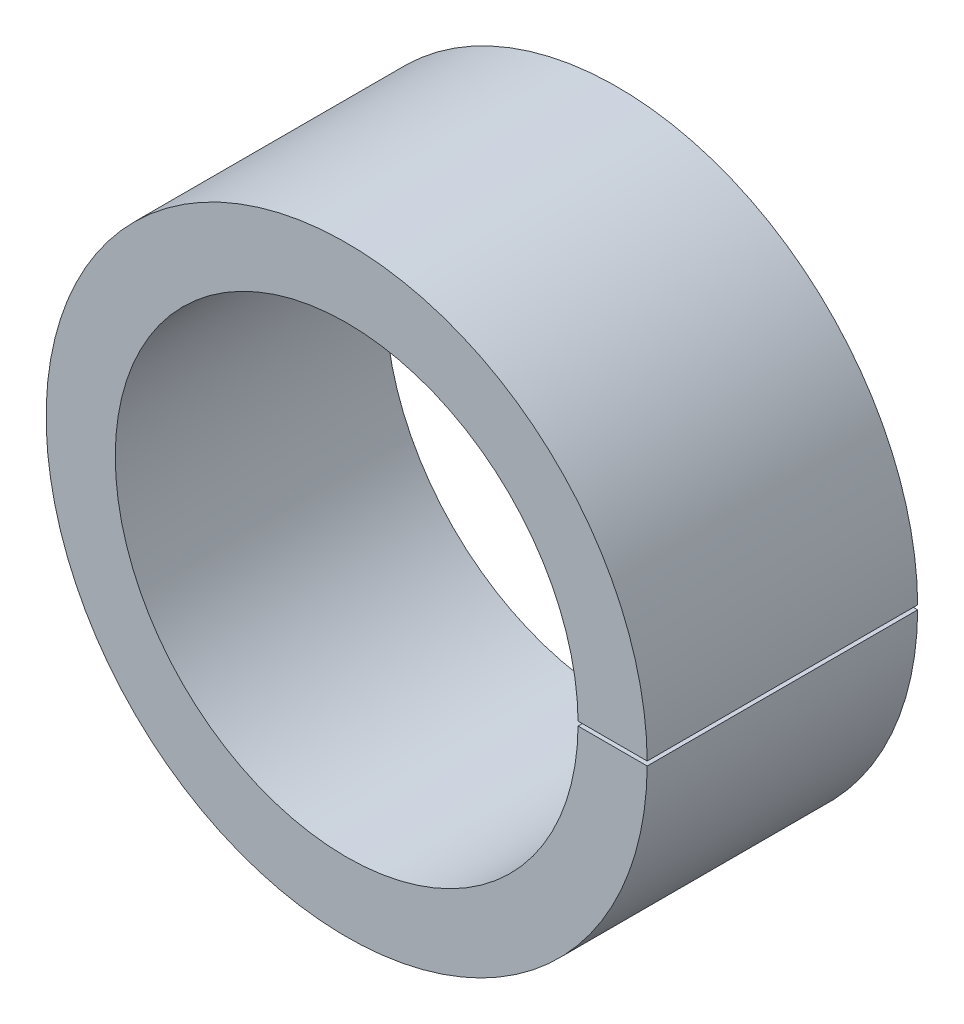
ISO-10303-21;
HEADER;
FILE_DESCRIPTION(('STEP AP214'),'2;1');
FILE_NAME('part.step','',(''),(''),'','','');
FILE_SCHEMA(('AUTOMOTIVE_DESIGN { 1 0 10303 214 1 1 1 1 }'));
ENDSEC;
DATA;
#1=APPLICATION_CONTEXT('core data for automotive mechanical design processes');
#2=APPLICATION_PROTOCOL_DEFINITION('international standard','automotive_design',2000,#1);
#3=PRODUCT_CONTEXT('',#1,'mechanical');
#4=PRODUCT('Part','Part','',(#3));
#5=PRODUCT_RELATED_PRODUCT_CATEGORY('part','',(#4));
#6=PRODUCT_DEFINITION_FORMATION('','',#4);
#7=PRODUCT_DEFINITION_CONTEXT('part definition',#1,'design');
#8=PRODUCT_DEFINITION('design','',#6,#7);
#9=PRODUCT_DEFINITION_SHAPE('','',#8);
#10=(LENGTH_UNIT() NAMED_UNIT(*) SI_UNIT(.MILLI.,.METRE.));
#11=(NAMED_UNIT(*) PLANE_ANGLE_UNIT() SI_UNIT($,.RADIAN.));
#12=(NAMED_UNIT(*) SI_UNIT($,.STERADIAN.) SOLID_ANGLE_UNIT());
#13=UNCERTAINTY_MEASURE_WITH_UNIT(LENGTH_MEASURE(1.E-05),#10,'distance_accuracy_value','');
#14=(GEOMETRIC_REPRESENTATION_CONTEXT(3) GLOBAL_UNCERTAINTY_ASSIGNED_CONTEXT((#13)) GLOBAL_UNIT_ASSIGNED_CONTEXT((#10,
#11,#12)) REPRESENTATION_CONTEXT('',''));
#15=CARTESIAN_POINT('',(0.,0.,0.));
#16=DIRECTION('',(0.,0.,1.));
#17=DIRECTION('',(1.,0.,0.));
#18=AXIS2_PLACEMENT_3D('',#15,#16,#17);
#19=CARTESIAN_POINT('',(0.,0.,4.7625));
#20=DIRECTION('',(0.,0.,-1.));
#21=DIRECTION('',(-1.,0.,0.));
#22=AXIS2_PLACEMENT_3D('',#19,#20,#21);
#23=CYLINDRICAL_SURFACE('',#22,6.35);
#24=CARTESIAN_POINT('',(0.,0.,-0.952500000000002));
#25=DIRECTION('',(0.,0.,-1.));
#26=DIRECTION('',(-1.,0.,0.));
#27=AXIS2_PLACEMENT_3D('',#24,#25,#26);
#28=CIRCLE('',#27,6.35);
#29=CARTESIAN_POINT('',(6.34984054917917,-0.045,-0.952500000000002));
#30=VERTEX_POINT('',#29);
#31=CARTESIAN_POINT('',(6.34984054917917,0.0450000000000023,-0.952500000000002));
#32=VERTEX_POINT('',#31);
#33=EDGE_CURVE('E47',#30,#32,#28,.T.);
#34=ORIENTED_EDGE('',*,*,#33,.F.);
#35=DIRECTION('',(0.,0.,-1.));
#36=VECTOR('',#35,1.);
#37=CARTESIAN_POINT('',(6.34984054917917,-0.045,4.7625));
#38=LINE('',#37,#36);
#39=CARTESIAN_POINT('',(6.34984054917917,-0.045,4.7625));
#40=VERTEX_POINT('',#39);
#41=EDGE_CURVE('E41',#40,#30,#38,.T.);
#42=ORIENTED_EDGE('',*,*,#41,.F.);
#43=CARTESIAN_POINT('',(0.,0.,4.7625));
#44=DIRECTION('',(0.,0.,1.));
#45=DIRECTION('',(1.,0.,0.));
#46=AXIS2_PLACEMENT_3D('',#43,#44,#45);
#47=CIRCLE('',#46,6.35);
#48=CARTESIAN_POINT('',(6.34984054917917,0.0450000000000023,4.7625));
#49=VERTEX_POINT('',#48);
#50=EDGE_CURVE('E101',#49,#40,#47,.T.);
#51=ORIENTED_EDGE('',*,*,#50,.F.);
#52=DIRECTION('',(0.,0.,-1.));
#53=VECTOR('',#52,1.);
#54=CARTESIAN_POINT('',(6.34984054917917,0.0450000000000023,4.7625));
#55=LINE('',#54,#53);
#56=EDGE_CURVE('E89',#49,#32,#55,.T.);
#57=ORIENTED_EDGE('',*,*,#56,.T.);
#58=EDGE_LOOP('',(#34,#42,#51,#57));
#59=FACE_BOUND('',#58,.T.);
#60=ADVANCED_FACE('F34',(#59),#23,.T.);
#61=CARTESIAN_POINT('',(4.88929291922666,-0.045,4.7625));
#62=DIRECTION('',(0.,-1.,0.));
#63=DIRECTION('',(0.,0.,-1.));
#64=AXIS2_PLACEMENT_3D('',#61,#62,#63);
#65=PLANE('',#64);
#66=DIRECTION('',(1.,0.,0.));
#67=VECTOR('',#66,1.);
#68=CARTESIAN_POINT('',(4.88929291922666,-0.045,-0.952500000000002));
#69=LINE('',#68,#67);
#70=CARTESIAN_POINT('',(4.88929291922666,-0.045,-0.952500000000002));
#71=VERTEX_POINT('',#70);
#72=EDGE_CURVE('E86',#71,#30,#69,.T.);
#73=ORIENTED_EDGE('',*,*,#72,.F.);
#74=DIRECTION('',(0.,0.,-1.));
#75=VECTOR('',#74,1.);
#76=CARTESIAN_POINT('',(4.88929291922666,-0.045,4.7625));
#77=LINE('',#76,#75);
#78=CARTESIAN_POINT('',(4.88929291922666,-0.045,4.7625));
#79=VERTEX_POINT('',#78);
#80=EDGE_CURVE('E85',#79,#71,#77,.T.);
#81=ORIENTED_EDGE('',*,*,#80,.F.);
#82=DIRECTION('',(-1.,0.,0.));
#83=VECTOR('',#82,1.);
#84=CARTESIAN_POINT('',(4.88929291922666,-0.045,4.7625));
#85=LINE('',#84,#83);
#86=EDGE_CURVE('E98',#40,#79,#85,.T.);
#87=ORIENTED_EDGE('',*,*,#86,.F.);
#88=ORIENTED_EDGE('',*,*,#41,.T.);
#89=EDGE_LOOP('',(#73,#81,#87,#88));
#90=FACE_BOUND('',#89,.T.);
#91=ADVANCED_FACE('F97',(#90),#65,.F.);
#92=CARTESIAN_POINT('',(0.,0.,4.7625));
#93=DIRECTION('',(0.,0.,-1.));
#94=DIRECTION('',(-1.,0.,0.));
#95=AXIS2_PLACEMENT_3D('',#92,#93,#94);
#96=CYLINDRICAL_SURFACE('',#95,4.8895);
#97=CARTESIAN_POINT('',(0.,0.,-0.952500000000002));
#98=DIRECTION('',(0.,0.,-1.));
#99=DIRECTION('',(-1.,0.,0.));
#100=AXIS2_PLACEMENT_3D('',#97,#98,#99);
#101=CIRCLE('',#100,4.8895);
#102=CARTESIAN_POINT('',(4.88929291922666,0.0450000000000018,-0.952500000000002));
#103=VERTEX_POINT('',#102);
#104=EDGE_CURVE('E73',#103,#71,#101,.F.);
#105=ORIENTED_EDGE('',*,*,#104,.F.);
#106=DIRECTION('',(0.,0.,-1.));
#107=VECTOR('',#106,1.);
#108=CARTESIAN_POINT('',(4.88929291922666,0.0450000000000018,4.7625));
#109=LINE('',#108,#107);
#110=CARTESIAN_POINT('',(4.88929291922666,0.0450000000000018,4.7625));
#111=VERTEX_POINT('',#110);
#112=EDGE_CURVE('E83',#111,#103,#109,.T.);
#113=ORIENTED_EDGE('',*,*,#112,.F.);
#114=CARTESIAN_POINT('',(0.,0.,4.7625));
#115=DIRECTION('',(0.,0.,-1.));
#116=DIRECTION('',(1.,0.,0.));
#117=AXIS2_PLACEMENT_3D('',#114,#115,#116);
#118=CIRCLE('',#117,4.8895);
#119=EDGE_CURVE('E107',#79,#111,#118,.T.);
#120=ORIENTED_EDGE('',*,*,#119,.F.);
#121=ORIENTED_EDGE('',*,*,#80,.T.);
#122=EDGE_LOOP('',(#105,#113,#120,#121));
#123=FACE_BOUND('',#122,.T.);
#124=ADVANCED_FACE('F81',(#123),#96,.F.);
#125=CARTESIAN_POINT('',(4.88929291922666,0.0450000000000018,4.7625));
#126=DIRECTION('',(0.,1.,0.));
#127=DIRECTION('',(-1.,0.,0.));
#128=AXIS2_PLACEMENT_3D('',#125,#126,#127);
#129=PLANE('',#128);
#130=DIRECTION('',(-1.,0.,0.));
#131=VECTOR('',#130,1.);
#132=CARTESIAN_POINT('',(4.88929291922666,0.0450000000000018,-0.952500000000002));
#133=LINE('',#132,#131);
#134=EDGE_CURVE('E11',#32,#103,#133,.T.);
#135=ORIENTED_EDGE('',*,*,#134,.F.);
#136=ORIENTED_EDGE('',*,*,#56,.F.);
#137=DIRECTION('',(1.,0.,0.));
#138=VECTOR('',#137,1.);
#139=CARTESIAN_POINT('',(4.88929291922666,0.0450000000000018,4.7625));
#140=LINE('',#139,#138);
#141=EDGE_CURVE('E55',#111,#49,#140,.T.);
#142=ORIENTED_EDGE('',*,*,#141,.F.);
#143=ORIENTED_EDGE('',*,*,#112,.T.);
#144=EDGE_LOOP('',(#135,#136,#142,#143));
#145=FACE_BOUND('',#144,.T.);
#146=ADVANCED_FACE('F88',(#145),#129,.F.);
#147=CARTESIAN_POINT('',(0.,0.,4.7625));
#148=DIRECTION('',(0.,0.,1.));
#149=DIRECTION('',(1.,0.,0.));
#150=AXIS2_PLACEMENT_3D('',#147,#148,#149);
#151=PLANE('',#150);
#152=ORIENTED_EDGE('',*,*,#50,.T.);
#153=ORIENTED_EDGE('',*,*,#86,.T.);
#154=ORIENTED_EDGE('',*,*,#119,.T.);
#155=ORIENTED_EDGE('',*,*,#141,.T.);
#156=EDGE_LOOP('',(#152,#153,#154,#155));
#157=FACE_BOUND('',#156,.T.);
#158=ADVANCED_FACE('F108',(#157),#151,.T.);
#159=CARTESIAN_POINT('',(0.,0.,-0.952500000000002));
#160=DIRECTION('',(0.,0.,-1.));
#161=DIRECTION('',(-1.,0.,0.));
#162=AXIS2_PLACEMENT_3D('',#159,#160,#161);
#163=PLANE('',#162);
#164=ORIENTED_EDGE('',*,*,#33,.T.);
#165=ORIENTED_EDGE('',*,*,#134,.T.);
#166=ORIENTED_EDGE('',*,*,#104,.T.);
#167=ORIENTED_EDGE('',*,*,#72,.T.);
#168=EDGE_LOOP('',(#164,#165,#166,#167));
#169=FACE_BOUND('',#168,.T.);
#170=ADVANCED_FACE('F72',(#169),#163,.T.);
#171=CLOSED_SHELL('',(#60,#91,#124,#146,#158,#170));
#172=MANIFOLD_SOLID_BREP('B2',#171);
#173=ADVANCED_BREP_SHAPE_REPRESENTATION('',(#18,#172),#14);
#174=SHAPE_DEFINITION_REPRESENTATION(#9,#173);
ENDSEC;
END-ISO-10303-21;
